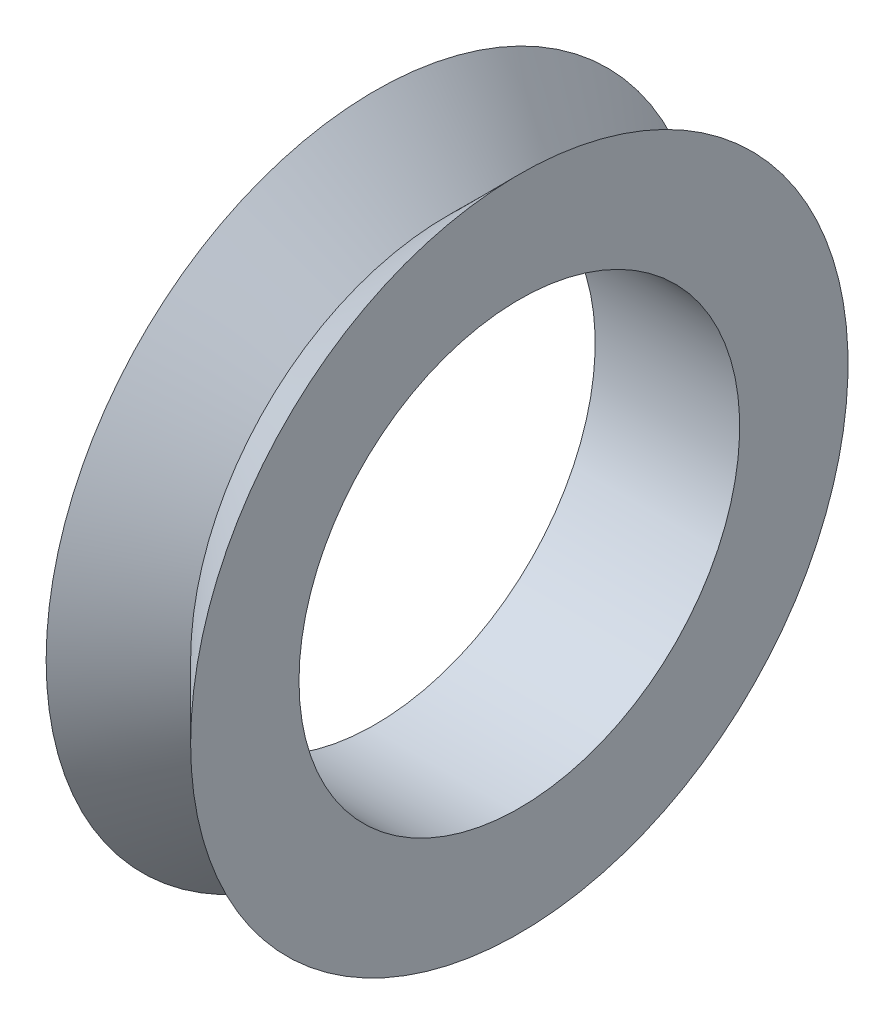
ISO-10303-21;
HEADER;
FILE_DESCRIPTION(('STEP AP214'),'2;1');
FILE_NAME('part.step','',(''),(''),'','','');
FILE_SCHEMA(('AUTOMOTIVE_DESIGN { 1 0 10303 214 1 1 1 1 }'));
ENDSEC;
DATA;
#1=APPLICATION_CONTEXT('core data for automotive mechanical design processes');
#2=APPLICATION_PROTOCOL_DEFINITION('international standard','automotive_design',2000,#1);
#3=PRODUCT_CONTEXT('',#1,'mechanical');
#4=PRODUCT('Part','Part','',(#3));
#5=PRODUCT_RELATED_PRODUCT_CATEGORY('part','',(#4));
#6=PRODUCT_DEFINITION_FORMATION('','',#4);
#7=PRODUCT_DEFINITION_CONTEXT('part definition',#1,'design');
#8=PRODUCT_DEFINITION('design','',#6,#7);
#9=PRODUCT_DEFINITION_SHAPE('','',#8);
#10=(LENGTH_UNIT() NAMED_UNIT(*) SI_UNIT(.MILLI.,.METRE.));
#11=(NAMED_UNIT(*) PLANE_ANGLE_UNIT() SI_UNIT($,.RADIAN.));
#12=(NAMED_UNIT(*) SI_UNIT($,.STERADIAN.) SOLID_ANGLE_UNIT());
#13=UNCERTAINTY_MEASURE_WITH_UNIT(LENGTH_MEASURE(1.E-05),#10,'distance_accuracy_value','');
#14=(GEOMETRIC_REPRESENTATION_CONTEXT(3) GLOBAL_UNCERTAINTY_ASSIGNED_CONTEXT((#13)) GLOBAL_UNIT_ASSIGNED_CONTEXT((#10,
#11,#12)) REPRESENTATION_CONTEXT('',''));
#15=CARTESIAN_POINT('',(0.,0.,0.));
#16=DIRECTION('',(0.,0.,1.));
#17=DIRECTION('',(1.,0.,0.));
#18=AXIS2_PLACEMENT_3D('',#15,#16,#17);
#19=CARTESIAN_POINT('',(2.,0.,0.));
#20=DIRECTION('',(1.,0.,0.));
#21=DIRECTION('',(0.,0.,-1.));
#22=AXIS2_PLACEMENT_3D('',#19,#20,#21);
#23=CONICAL_SURFACE('',#22,9.1,0.785398163397448);
#24=CARTESIAN_POINT('',(0.,0.,0.));
#25=DIRECTION('',(-1.,0.,0.));
#26=DIRECTION('',(0.,0.,1.));
#27=AXIS2_PLACEMENT_3D('',#24,#25,#26);
#28=CIRCLE('',#27,7.1);
#29=CARTESIAN_POINT('',(0.,0.,7.1));
#30=VERTEX_POINT('',#29);
#31=EDGE_CURVE('E10',#30,#30,#28,.T.);
#32=ORIENTED_EDGE('',*,*,#31,.F.);
#33=EDGE_LOOP('',(#32));
#34=FACE_BOUND('',#33,.T.);
#35=CARTESIAN_POINT('',(2.,0.,0.));
#36=DIRECTION('',(-1.,0.,0.));
#37=DIRECTION('',(0.,0.,1.));
#38=AXIS2_PLACEMENT_3D('',#35,#36,#37);
#39=CIRCLE('',#38,9.1);
#40=CARTESIAN_POINT('',(2.,0.,9.1));
#41=VERTEX_POINT('',#40);
#42=EDGE_CURVE('E51',#41,#41,#39,.T.);
#43=ORIENTED_EDGE('',*,*,#42,.T.);
#44=EDGE_LOOP('',(#43));
#45=FACE_BOUND('',#44,.T.);
#46=ADVANCED_FACE('F32',(#34,#45),#23,.T.);
#47=CARTESIAN_POINT('',(0.,0.,0.));
#48=DIRECTION('',(-1.,0.,0.));
#49=DIRECTION('',(0.,0.,1.));
#50=AXIS2_PLACEMENT_3D('',#47,#48,#49);
#51=CONICAL_SURFACE('',#50,7.1,0.785398163397448);
#52=CARTESIAN_POINT('',(-2.,0.,0.));
#53=DIRECTION('',(-1.,0.,0.));
#54=DIRECTION('',(0.,0.,1.));
#55=AXIS2_PLACEMENT_3D('',#52,#53,#54);
#56=CIRCLE('',#55,9.1);
#57=CARTESIAN_POINT('',(-2.,0.,9.1));
#58=VERTEX_POINT('',#57);
#59=EDGE_CURVE('E38',#58,#58,#56,.T.);
#60=ORIENTED_EDGE('',*,*,#59,.F.);
#61=EDGE_LOOP('',(#60));
#62=FACE_BOUND('',#61,.T.);
#63=ORIENTED_EDGE('',*,*,#31,.T.);
#64=EDGE_LOOP('',(#63));
#65=FACE_BOUND('',#64,.T.);
#66=ADVANCED_FACE('F70',(#62,#65),#51,.T.);
#67=CARTESIAN_POINT('',(-2.,6.1,0.));
#68=DIRECTION('',(1.,0.,0.));
#69=DIRECTION('',(0.,0.,-1.));
#70=AXIS2_PLACEMENT_3D('',#67,#68,#69);
#71=PLANE('',#70);
#72=CARTESIAN_POINT('',(-2.,0.,0.));
#73=DIRECTION('',(-1.,0.,0.));
#74=DIRECTION('',(0.,0.,1.));
#75=AXIS2_PLACEMENT_3D('',#72,#73,#74);
#76=CIRCLE('',#75,6.1);
#77=CARTESIAN_POINT('',(-2.,0.,6.1));
#78=VERTEX_POINT('',#77);
#79=EDGE_CURVE('E42',#78,#78,#76,.T.);
#80=ORIENTED_EDGE('',*,*,#79,.F.);
#81=EDGE_LOOP('',(#80));
#82=FACE_BOUND('',#81,.T.);
#83=ORIENTED_EDGE('',*,*,#59,.T.);
#84=EDGE_LOOP('',(#83));
#85=FACE_BOUND('',#84,.T.);
#86=ADVANCED_FACE('F65',(#82,#85),#71,.F.);
#87=CARTESIAN_POINT('',(-6.92407809110628,0.,0.));
#88=DIRECTION('',(-1.,0.,0.));
#89=DIRECTION('',(0.,0.,1.));
#90=AXIS2_PLACEMENT_3D('',#87,#88,#89);
#91=CYLINDRICAL_SURFACE('',#90,6.1);
#92=CARTESIAN_POINT('',(2.,0.,0.));
#93=DIRECTION('',(-1.,0.,0.));
#94=DIRECTION('',(0.,0.,1.));
#95=AXIS2_PLACEMENT_3D('',#92,#93,#94);
#96=CIRCLE('',#95,6.1);
#97=CARTESIAN_POINT('',(2.,0.,6.1));
#98=VERTEX_POINT('',#97);
#99=EDGE_CURVE('E46',#98,#98,#96,.T.);
#100=ORIENTED_EDGE('',*,*,#99,.F.);
#101=EDGE_LOOP('',(#100));
#102=FACE_BOUND('',#101,.T.);
#103=ORIENTED_EDGE('',*,*,#79,.T.);
#104=EDGE_LOOP('',(#103));
#105=FACE_BOUND('',#104,.T.);
#106=ADVANCED_FACE('F59',(#102,#105),#91,.F.);
#107=CARTESIAN_POINT('',(2.,6.1,0.));
#108=DIRECTION('',(-1.,0.,0.));
#109=DIRECTION('',(0.,0.,1.));
#110=AXIS2_PLACEMENT_3D('',#107,#108,#109);
#111=PLANE('',#110);
#112=ORIENTED_EDGE('',*,*,#42,.F.);
#113=EDGE_LOOP('',(#112));
#114=FACE_BOUND('',#113,.T.);
#115=ORIENTED_EDGE('',*,*,#99,.T.);
#116=EDGE_LOOP('',(#115));
#117=FACE_BOUND('',#116,.T.);
#118=ADVANCED_FACE('F56',(#114,#117),#111,.F.);
#119=CLOSED_SHELL('',(#46,#66,#86,#106,#118));
#120=MANIFOLD_SOLID_BREP('B2',#119);
#121=ADVANCED_BREP_SHAPE_REPRESENTATION('',(#18,#120),#14);
#122=SHAPE_DEFINITION_REPRESENTATION(#9,#121);
ENDSEC;
END-ISO-10303-21;
